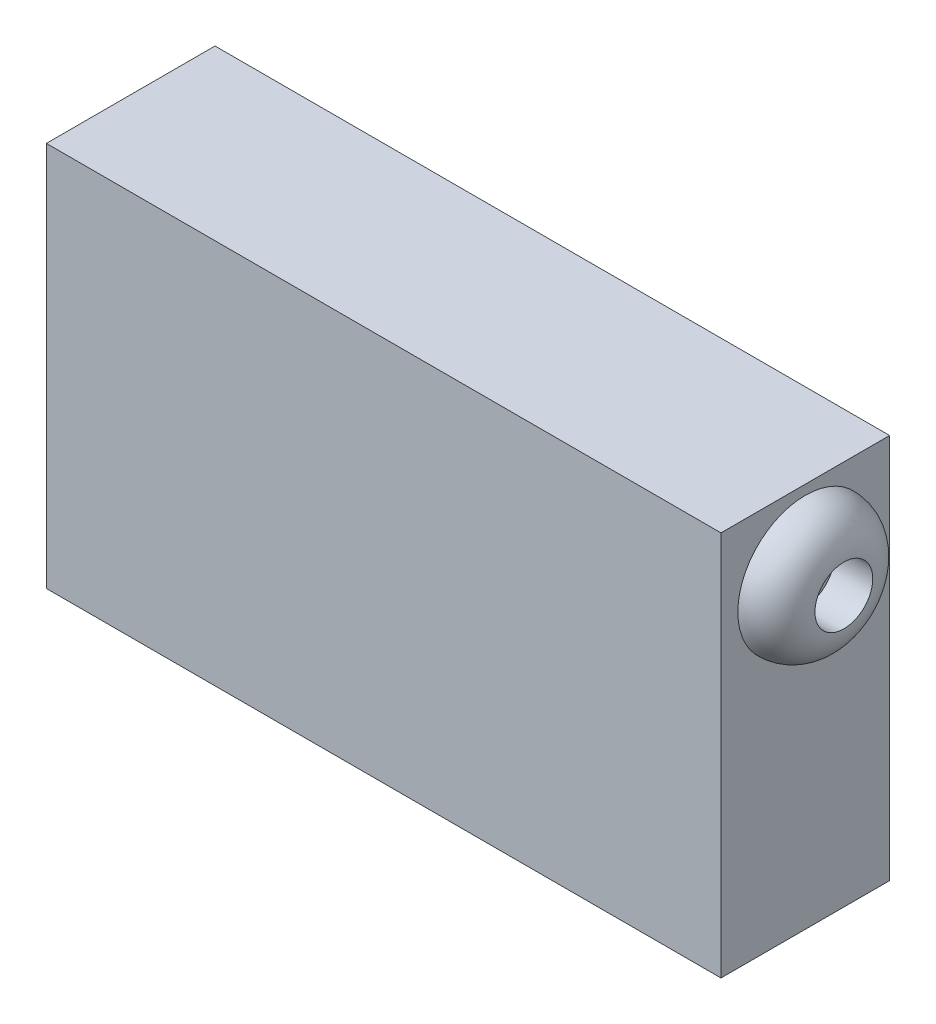
ISO-10303-21;
HEADER;
FILE_DESCRIPTION(('STEP AP214'),'2;1');
FILE_NAME('part.step','',(''),(''),'','','');
FILE_SCHEMA(('AUTOMOTIVE_DESIGN { 1 0 10303 214 1 1 1 1 }'));
ENDSEC;
DATA;
#1=APPLICATION_CONTEXT('core data for automotive mechanical design processes');
#2=APPLICATION_PROTOCOL_DEFINITION('international standard','automotive_design',2000,#1);
#3=PRODUCT_CONTEXT('',#1,'mechanical');
#4=PRODUCT('Part','Part','',(#3));
#5=PRODUCT_RELATED_PRODUCT_CATEGORY('part','',(#4));
#6=PRODUCT_DEFINITION_FORMATION('','',#4);
#7=PRODUCT_DEFINITION_CONTEXT('part definition',#1,'design');
#8=PRODUCT_DEFINITION('design','',#6,#7);
#9=PRODUCT_DEFINITION_SHAPE('','',#8);
#10=(LENGTH_UNIT() NAMED_UNIT(*) SI_UNIT(.MILLI.,.METRE.));
#11=(NAMED_UNIT(*) PLANE_ANGLE_UNIT() SI_UNIT($,.RADIAN.));
#12=(NAMED_UNIT(*) SI_UNIT($,.STERADIAN.) SOLID_ANGLE_UNIT());
#13=UNCERTAINTY_MEASURE_WITH_UNIT(LENGTH_MEASURE(1.E-05),#10,'distance_accuracy_value','');
#14=(GEOMETRIC_REPRESENTATION_CONTEXT(3) GLOBAL_UNCERTAINTY_ASSIGNED_CONTEXT((#13)) GLOBAL_UNIT_ASSIGNED_CONTEXT((#10,
#11,#12)) REPRESENTATION_CONTEXT('',''));
#15=CARTESIAN_POINT('',(0.,0.,0.));
#16=DIRECTION('',(0.,0.,1.));
#17=DIRECTION('',(1.,0.,0.));
#18=AXIS2_PLACEMENT_3D('',#15,#16,#17);
#19=CARTESIAN_POINT('',(17.5,20.,-4.375));
#20=DIRECTION('',(-1.,0.,0.));
#21=DIRECTION('',(0.,0.,1.));
#22=AXIS2_PLACEMENT_3D('',#19,#20,#21);
#23=PLANE('',#22);
#24=CARTESIAN_POINT('',(17.5,16.,0.));
#25=DIRECTION('',(-1.,0.,0.));
#26=DIRECTION('',(0.,0.,1.));
#27=AXIS2_PLACEMENT_3D('',#24,#25,#26);
#28=CIRCLE('',#27,3.5);
#29=CARTESIAN_POINT('',(17.5,16.,3.49999999999999));
#30=VERTEX_POINT('',#29);
#31=EDGE_CURVE('E11',#30,#30,#28,.F.);
#32=ORIENTED_EDGE('',*,*,#31,.F.);
#33=EDGE_LOOP('',(#32));
#34=FACE_BOUND('',#33,.T.);
#35=DIRECTION('',(0.,0.,-1.));
#36=VECTOR('',#35,1.);
#37=CARTESIAN_POINT('',(17.5,0.,-4.375));
#38=LINE('',#37,#36);
#39=CARTESIAN_POINT('',(17.5,0.,4.375));
#40=VERTEX_POINT('',#39);
#41=CARTESIAN_POINT('',(17.5,0.,-4.375));
#42=VERTEX_POINT('',#41);
#43=EDGE_CURVE('E117',#40,#42,#38,.T.);
#44=ORIENTED_EDGE('',*,*,#43,.T.);
#45=DIRECTION('',(0.,-1.,0.));
#46=VECTOR('',#45,1.);
#47=CARTESIAN_POINT('',(17.5,20.,-4.375));
#48=LINE('',#47,#46);
#49=CARTESIAN_POINT('',(17.5,20.,-4.375));
#50=VERTEX_POINT('',#49);
#51=EDGE_CURVE('E55',#50,#42,#48,.T.);
#52=ORIENTED_EDGE('',*,*,#51,.F.);
#53=DIRECTION('',(0.,0.,-1.));
#54=VECTOR('',#53,1.);
#55=CARTESIAN_POINT('',(17.5,20.,-4.375));
#56=LINE('',#55,#54);
#57=CARTESIAN_POINT('',(17.5,20.,4.375));
#58=VERTEX_POINT('',#57);
#59=EDGE_CURVE('E99',#58,#50,#56,.T.);
#60=ORIENTED_EDGE('',*,*,#59,.F.);
#61=DIRECTION('',(0.,-1.,0.));
#62=VECTOR('',#61,1.);
#63=CARTESIAN_POINT('',(17.5,20.,4.375));
#64=LINE('',#63,#62);
#65=EDGE_CURVE('E113',#58,#40,#64,.T.);
#66=ORIENTED_EDGE('',*,*,#65,.T.);
#67=EDGE_LOOP('',(#44,#52,#60,#66));
#68=FACE_BOUND('',#67,.T.);
#69=ADVANCED_FACE('F45',(#34,#68),#23,.F.);
#70=CARTESIAN_POINT('',(-17.5,20.,-4.375));
#71=DIRECTION('',(0.,0.,1.));
#72=DIRECTION('',(1.,0.,0.));
#73=AXIS2_PLACEMENT_3D('',#70,#71,#72);
#74=PLANE('',#73);
#75=DIRECTION('',(-1.,0.,0.));
#76=VECTOR('',#75,1.);
#77=CARTESIAN_POINT('',(-17.5,0.,-4.375));
#78=LINE('',#77,#76);
#79=CARTESIAN_POINT('',(-17.5,0.,-4.375));
#80=VERTEX_POINT('',#79);
#81=EDGE_CURVE('E105',#42,#80,#78,.T.);
#82=ORIENTED_EDGE('',*,*,#81,.T.);
#83=DIRECTION('',(0.,-1.,0.));
#84=VECTOR('',#83,1.);
#85=CARTESIAN_POINT('',(-17.5,20.,-4.375));
#86=LINE('',#85,#84);
#87=CARTESIAN_POINT('',(-17.5,20.,-4.375));
#88=VERTEX_POINT('',#87);
#89=EDGE_CURVE('E103',#88,#80,#86,.T.);
#90=ORIENTED_EDGE('',*,*,#89,.F.);
#91=DIRECTION('',(-1.,0.,0.));
#92=VECTOR('',#91,1.);
#93=CARTESIAN_POINT('',(-17.5,20.,-4.375));
#94=LINE('',#93,#92);
#95=EDGE_CURVE('E94',#50,#88,#94,.T.);
#96=ORIENTED_EDGE('',*,*,#95,.F.);
#97=ORIENTED_EDGE('',*,*,#51,.T.);
#98=EDGE_LOOP('',(#82,#90,#96,#97));
#99=FACE_BOUND('',#98,.T.);
#100=ADVANCED_FACE('F104',(#99),#74,.F.);
#101=CARTESIAN_POINT('',(-17.5,20.,-4.375));
#102=DIRECTION('',(1.,0.,0.));
#103=DIRECTION('',(0.,0.,-1.));
#104=AXIS2_PLACEMENT_3D('',#101,#102,#103);
#105=PLANE('',#104);
#106=DIRECTION('',(0.,0.,1.));
#107=VECTOR('',#106,1.);
#108=CARTESIAN_POINT('',(-17.5,0.,-4.375));
#109=LINE('',#108,#107);
#110=CARTESIAN_POINT('',(-17.5,0.,4.375));
#111=VERTEX_POINT('',#110);
#112=EDGE_CURVE('E80',#80,#111,#109,.T.);
#113=ORIENTED_EDGE('',*,*,#112,.T.);
#114=DIRECTION('',(0.,-1.,0.));
#115=VECTOR('',#114,1.);
#116=CARTESIAN_POINT('',(-17.5,20.,4.375));
#117=LINE('',#116,#115);
#118=CARTESIAN_POINT('',(-17.5,20.,4.375));
#119=VERTEX_POINT('',#118);
#120=EDGE_CURVE('E107',#119,#111,#117,.T.);
#121=ORIENTED_EDGE('',*,*,#120,.F.);
#122=DIRECTION('',(0.,0.,1.));
#123=VECTOR('',#122,1.);
#124=CARTESIAN_POINT('',(-17.5,20.,-4.375));
#125=LINE('',#124,#123);
#126=EDGE_CURVE('E97',#88,#119,#125,.T.);
#127=ORIENTED_EDGE('',*,*,#126,.F.);
#128=ORIENTED_EDGE('',*,*,#89,.T.);
#129=EDGE_LOOP('',(#113,#121,#127,#128));
#130=FACE_BOUND('',#129,.T.);
#131=ADVANCED_FACE('F109',(#130),#105,.F.);
#132=CARTESIAN_POINT('',(-17.5,20.,4.375));
#133=DIRECTION('',(0.,0.,-1.));
#134=DIRECTION('',(-1.,0.,0.));
#135=AXIS2_PLACEMENT_3D('',#132,#133,#134);
#136=PLANE('',#135);
#137=DIRECTION('',(1.,0.,0.));
#138=VECTOR('',#137,1.);
#139=CARTESIAN_POINT('',(-17.5,0.,4.375));
#140=LINE('',#139,#138);
#141=EDGE_CURVE('E86',#111,#40,#140,.T.);
#142=ORIENTED_EDGE('',*,*,#141,.T.);
#143=ORIENTED_EDGE('',*,*,#65,.F.);
#144=DIRECTION('',(1.,0.,0.));
#145=VECTOR('',#144,1.);
#146=CARTESIAN_POINT('',(-17.5,20.,4.375));
#147=LINE('',#146,#145);
#148=EDGE_CURVE('E63',#119,#58,#147,.T.);
#149=ORIENTED_EDGE('',*,*,#148,.F.);
#150=ORIENTED_EDGE('',*,*,#120,.T.);
#151=EDGE_LOOP('',(#142,#143,#149,#150));
#152=FACE_BOUND('',#151,.T.);
#153=ADVANCED_FACE('F146',(#152),#136,.F.);
#154=CARTESIAN_POINT('',(0.,20.,0.));
#155=DIRECTION('',(0.,1.,0.));
#156=DIRECTION('',(0.,0.,1.));
#157=AXIS2_PLACEMENT_3D('',#154,#155,#156);
#158=PLANE('',#157);
#159=ORIENTED_EDGE('',*,*,#59,.T.);
#160=ORIENTED_EDGE('',*,*,#95,.T.);
#161=ORIENTED_EDGE('',*,*,#126,.T.);
#162=ORIENTED_EDGE('',*,*,#148,.T.);
#163=EDGE_LOOP('',(#159,#160,#161,#162));
#164=FACE_BOUND('',#163,.T.);
#165=ADVANCED_FACE('F95',(#164),#158,.T.);
#166=CARTESIAN_POINT('',(0.,0.,0.));
#167=DIRECTION('',(0.,1.,0.));
#168=DIRECTION('',(0.,0.,1.));
#169=AXIS2_PLACEMENT_3D('',#166,#167,#168);
#170=PLANE('',#169);
#171=ORIENTED_EDGE('',*,*,#43,.F.);
#172=ORIENTED_EDGE('',*,*,#141,.F.);
#173=ORIENTED_EDGE('',*,*,#112,.F.);
#174=ORIENTED_EDGE('',*,*,#81,.F.);
#175=EDGE_LOOP('',(#171,#172,#173,#174));
#176=FACE_BOUND('',#175,.T.);
#177=ADVANCED_FACE('F135',(#176),#170,.F.);
#178=CARTESIAN_POINT('',(17.5,16.,0.));
#179=DIRECTION('',(1.,0.,0.));
#180=DIRECTION('',(0.,0.,-1.));
#181=AXIS2_PLACEMENT_3D('',#178,#179,#180);
#182=CYLINDRICAL_SURFACE('',#181,1.5);
#183=CARTESIAN_POINT('',(17.5,16.,0.));
#184=DIRECTION('',(1.,0.,0.));
#185=DIRECTION('',(0.,0.,-1.));
#186=AXIS2_PLACEMENT_3D('',#183,#184,#185);
#187=CIRCLE('',#186,1.5);
#188=CARTESIAN_POINT('',(17.5,16.,-1.50000000000001));
#189=VERTEX_POINT('',#188);
#190=EDGE_CURVE('E121',#189,#189,#187,.T.);
#191=ORIENTED_EDGE('',*,*,#190,.F.);
#192=EDGE_LOOP('',(#191));
#193=FACE_BOUND('',#192,.T.);
#194=CARTESIAN_POINT('',(19.5,16.,0.));
#195=DIRECTION('',(1.,0.,0.));
#196=DIRECTION('',(0.,0.,-1.));
#197=AXIS2_PLACEMENT_3D('',#194,#195,#196);
#198=CIRCLE('',#197,1.5);
#199=CARTESIAN_POINT('',(19.5,16.,-1.50000000000001));
#200=VERTEX_POINT('',#199);
#201=EDGE_CURVE('E241',#200,#200,#198,.T.);
#202=ORIENTED_EDGE('',*,*,#201,.T.);
#203=EDGE_LOOP('',(#202));
#204=FACE_BOUND('',#203,.T.);
#205=ADVANCED_FACE('F137',(#193,#204),#182,.F.);
#206=CARTESIAN_POINT('',(17.5,16.,0.));
#207=DIRECTION('',(1.,0.,0.));
#208=DIRECTION('',(0.,0.,-1.));
#209=AXIS2_PLACEMENT_3D('',#206,#207,#208);
#210=PLANE('',#209);
#211=ORIENTED_EDGE('',*,*,#190,.T.);
#212=EDGE_LOOP('',(#211));
#213=FACE_BOUND('',#212,.T.);
#214=ADVANCED_FACE('F143',(#213),#210,.T.);
#215=CARTESIAN_POINT('',(17.5,16.,0.));
#216=DIRECTION('',(1.,0.,0.));
#217=DIRECTION('',(0.,0.,-1.));
#218=AXIS2_PLACEMENT_3D('',#215,#216,#217);
#219=DEGENERATE_TOROIDAL_SURFACE('',#218,1.5,2.,.T.);
#220=ORIENTED_EDGE('',*,*,#31,.T.);
#221=EDGE_LOOP('',(#220));
#222=FACE_BOUND('',#221,.T.);
#223=ORIENTED_EDGE('',*,*,#201,.F.);
#224=EDGE_LOOP('',(#223));
#225=FACE_BOUND('',#224,.T.);
#226=ADVANCED_FACE('F47',(#222,#225),#219,.T.);
#227=CLOSED_SHELL('',(#69,#100,#131,#153,#165,#177,#205,#214,#226));
#228=MANIFOLD_SOLID_BREP('B2',#227);
#229=ADVANCED_BREP_SHAPE_REPRESENTATION('',(#18,#228),#14);
#230=SHAPE_DEFINITION_REPRESENTATION(#9,#229);
ENDSEC;
END-ISO-10303-21;
